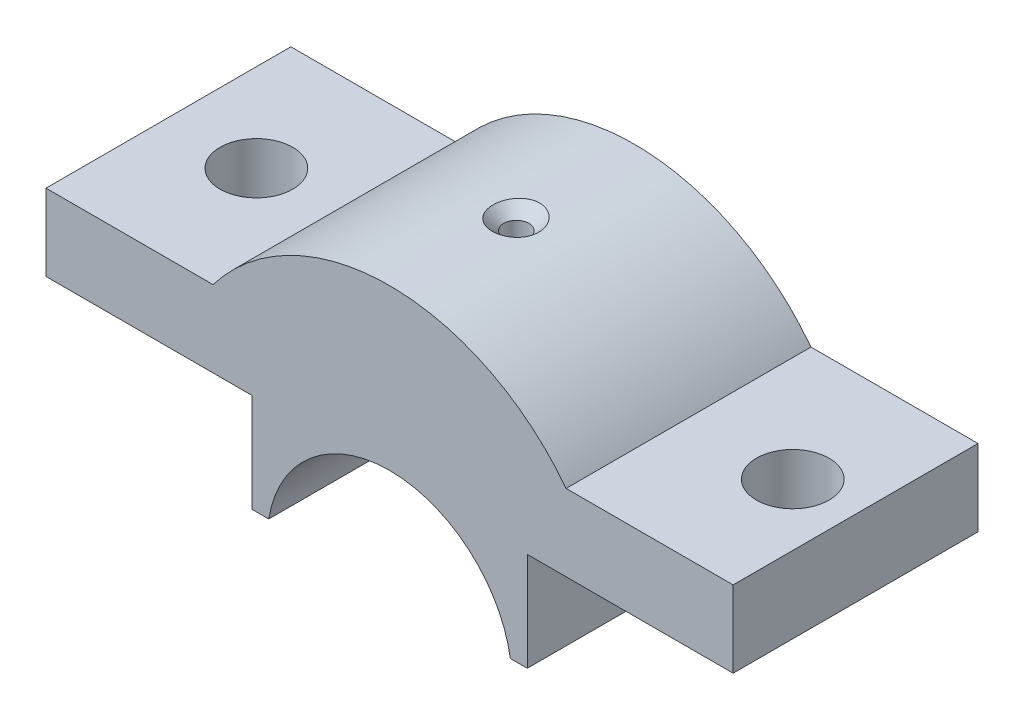
ISO-10303-21;
HEADER;
FILE_DESCRIPTION(('STEP AP214'),'2;1');
FILE_NAME('part.step','',(''),(''),'','','');
FILE_SCHEMA(('AUTOMOTIVE_DESIGN { 1 0 10303 214 1 1 1 1 }'));
ENDSEC;
DATA;
#1=APPLICATION_CONTEXT('core data for automotive mechanical design processes');
#2=APPLICATION_PROTOCOL_DEFINITION('international standard','automotive_design',2000,#1);
#3=PRODUCT_CONTEXT('',#1,'mechanical');
#4=PRODUCT('Part','Part','',(#3));
#5=PRODUCT_RELATED_PRODUCT_CATEGORY('part','',(#4));
#6=PRODUCT_DEFINITION_FORMATION('','',#4);
#7=PRODUCT_DEFINITION_CONTEXT('part definition',#1,'design');
#8=PRODUCT_DEFINITION('design','',#6,#7);
#9=PRODUCT_DEFINITION_SHAPE('','',#8);
#10=(LENGTH_UNIT() NAMED_UNIT(*) SI_UNIT(.MILLI.,.METRE.));
#11=(NAMED_UNIT(*) PLANE_ANGLE_UNIT() SI_UNIT($,.RADIAN.));
#12=(NAMED_UNIT(*) SI_UNIT($,.STERADIAN.) SOLID_ANGLE_UNIT());
#13=UNCERTAINTY_MEASURE_WITH_UNIT(LENGTH_MEASURE(1.E-05),#10,'distance_accuracy_value','');
#14=(GEOMETRIC_REPRESENTATION_CONTEXT(3) GLOBAL_UNCERTAINTY_ASSIGNED_CONTEXT((#13)) GLOBAL_UNIT_ASSIGNED_CONTEXT((#10,
#11,#12)) REPRESENTATION_CONTEXT('',''));
#15=CARTESIAN_POINT('',(0.,0.,0.));
#16=DIRECTION('',(0.,0.,1.));
#17=DIRECTION('',(1.,0.,0.));
#18=AXIS2_PLACEMENT_3D('',#15,#16,#17);
#19=CARTESIAN_POINT('',(53.7975933810534,0.,64.));
#20=DIRECTION('',(0.,1.,0.));
#21=DIRECTION('',(-1.,0.,0.));
#22=AXIS2_PLACEMENT_3D('',#19,#20,#21);
#23=PLANE('',#22);
#24=CARTESIAN_POINT('',(22.9880072725701,0.,32.));
#25=DIRECTION('',(0.,1.,0.));
#26=DIRECTION('',(-1.,0.,0.));
#27=AXIS2_PLACEMENT_3D('',#24,#25,#26);
#28=CIRCLE('',#27,9.49999999999997);
#29=CARTESIAN_POINT('',(13.4880072725701,0.,32.));
#30=VERTEX_POINT('',#29);
#31=EDGE_CURVE('E297',#30,#30,#28,.T.);
#32=ORIENTED_EDGE('',*,*,#31,.T.);
#33=EDGE_LOOP('',(#32));
#34=FACE_BOUND('',#33,.T.);
#35=DIRECTION('',(1.,0.,0.));
#36=VECTOR('',#35,1.);
#37=CARTESIAN_POINT('',(53.7975933810534,0.,0.));
#38=LINE('',#37,#36);
#39=CARTESIAN_POINT('',(0.,0.,0.));
#40=VERTEX_POINT('',#39);
#41=CARTESIAN_POINT('',(53.7975933810534,0.,0.));
#42=VERTEX_POINT('',#41);
#43=EDGE_CURVE('E171',#40,#42,#38,.T.);
#44=ORIENTED_EDGE('',*,*,#43,.T.);
#45=DIRECTION('',(0.,0.,-1.));
#46=VECTOR('',#45,1.);
#47=CARTESIAN_POINT('',(53.7975933810534,0.,64.));
#48=LINE('',#47,#46);
#49=CARTESIAN_POINT('',(53.7975933810534,0.,64.));
#50=VERTEX_POINT('',#49);
#51=EDGE_CURVE('E54',#50,#42,#48,.T.);
#52=ORIENTED_EDGE('',*,*,#51,.F.);
#53=DIRECTION('',(1.,0.,0.));
#54=VECTOR('',#53,1.);
#55=CARTESIAN_POINT('',(53.7975933810534,0.,64.));
#56=LINE('',#55,#54);
#57=CARTESIAN_POINT('',(0.,0.,64.));
#58=VERTEX_POINT('',#57);
#59=EDGE_CURVE('E206',#58,#50,#56,.T.);
#60=ORIENTED_EDGE('',*,*,#59,.F.);
#61=DIRECTION('',(0.,0.,-1.));
#62=VECTOR('',#61,1.);
#63=CARTESIAN_POINT('',(0.,0.,64.));
#64=LINE('',#63,#62);
#65=EDGE_CURVE('E167',#58,#40,#64,.T.);
#66=ORIENTED_EDGE('',*,*,#65,.T.);
#67=EDGE_LOOP('',(#44,#52,#60,#66));
#68=FACE_BOUND('',#67,.T.);
#69=ADVANCED_FACE('F39',(#34,#68),#23,.F.);
#70=CARTESIAN_POINT('',(53.7975933810534,0.,64.));
#71=DIRECTION('',(1.,0.,0.));
#72=DIRECTION('',(0.,0.,-1.));
#73=AXIS2_PLACEMENT_3D('',#70,#71,#72);
#74=PLANE('',#73);
#75=DIRECTION('',(0.,-1.,0.));
#76=VECTOR('',#75,1.);
#77=CARTESIAN_POINT('',(53.7975933810534,0.,0.));
#78=LINE('',#77,#76);
#79=CARTESIAN_POINT('',(53.7975933810534,-25.7783589135465,0.));
#80=VERTEX_POINT('',#79);
#81=EDGE_CURVE('E175',#42,#80,#78,.T.);
#82=ORIENTED_EDGE('',*,*,#81,.T.);
#83=DIRECTION('',(0.,0.,-1.));
#84=VECTOR('',#83,1.);
#85=CARTESIAN_POINT('',(53.7975933810534,-25.7783589135465,64.));
#86=LINE('',#85,#84);
#87=CARTESIAN_POINT('',(53.7975933810534,-25.7783589135465,64.));
#88=VERTEX_POINT('',#87);
#89=EDGE_CURVE('E237',#88,#80,#86,.T.);
#90=ORIENTED_EDGE('',*,*,#89,.F.);
#91=DIRECTION('',(0.,-1.,0.));
#92=VECTOR('',#91,1.);
#93=CARTESIAN_POINT('',(53.7975933810534,0.,64.));
#94=LINE('',#93,#92);
#95=EDGE_CURVE('E118',#50,#88,#94,.T.);
#96=ORIENTED_EDGE('',*,*,#95,.F.);
#97=ORIENTED_EDGE('',*,*,#51,.T.);
#98=EDGE_LOOP('',(#82,#90,#96,#97));
#99=FACE_BOUND('',#98,.T.);
#100=ADVANCED_FACE('F288',(#99),#74,.F.);
#101=CARTESIAN_POINT('',(53.7975933810534,-25.7783589135465,64.));
#102=DIRECTION('',(0.,1.,0.));
#103=DIRECTION('',(0.,0.,1.));
#104=AXIS2_PLACEMENT_3D('',#101,#102,#103);
#105=PLANE('',#104);
#106=DIRECTION('',(1.,0.,0.));
#107=VECTOR('',#106,1.);
#108=CARTESIAN_POINT('',(53.7975933810534,-25.7783589135465,0.));
#109=LINE('',#108,#107);
#110=CARTESIAN_POINT('',(58.2241677918507,-25.7783589135465,0.));
#111=VERTEX_POINT('',#110);
#112=EDGE_CURVE('E179',#80,#111,#109,.T.);
#113=ORIENTED_EDGE('',*,*,#112,.T.);
#114=DIRECTION('',(0.,0.,-1.));
#115=VECTOR('',#114,1.);
#116=CARTESIAN_POINT('',(58.2241677918507,-25.7783589135465,64.));
#117=LINE('',#116,#115);
#118=CARTESIAN_POINT('',(58.2241677918507,-25.7783589135465,64.));
#119=VERTEX_POINT('',#118);
#120=EDGE_CURVE('E233',#119,#111,#117,.T.);
#121=ORIENTED_EDGE('',*,*,#120,.F.);
#122=DIRECTION('',(1.,0.,0.));
#123=VECTOR('',#122,1.);
#124=CARTESIAN_POINT('',(53.7975933810534,-25.7783589135465,64.));
#125=LINE('',#124,#123);
#126=EDGE_CURVE('E306',#88,#119,#125,.T.);
#127=ORIENTED_EDGE('',*,*,#126,.F.);
#128=ORIENTED_EDGE('',*,*,#89,.T.);
#129=EDGE_LOOP('',(#113,#121,#127,#128));
#130=FACE_BOUND('',#129,.T.);
#131=ADVANCED_FACE('F293',(#130),#105,.F.);
#132=CARTESIAN_POINT('',(89.7975933810534,-30.98592999449,64.));
#133=DIRECTION('',(0.,0.,-1.));
#134=DIRECTION('',(-1.,0.,0.));
#135=AXIS2_PLACEMENT_3D('',#132,#133,#134);
#136=CYLINDRICAL_SURFACE('',#135,32.);
#137=CARTESIAN_POINT('',(90.9345285111195,0.993866416838553,35.3));
#138=CARTESIAN_POINT('',(91.1198719424448,0.987274915184741,35.2999919183572));
#139=CARTESIAN_POINT('',(91.3052818610827,0.979054984777652,35.2843325939835));
#140=CARTESIAN_POINT('',(91.6708426633338,0.959719979045138,35.222156603377));
#141=CARTESIAN_POINT('',(91.8509873183535,0.948601617817875,35.1756048217086));
#142=CARTESIAN_POINT('',(92.2006784070634,0.924192008496801,35.0530562931811));
#143=CARTESIAN_POINT('',(92.3702321840717,0.910902289586623,34.9770802172158));
#144=CARTESIAN_POINT('',(92.6941077976478,0.883124863740967,34.7978801122881));
#145=CARTESIAN_POINT('',(92.8484326708329,0.86863739669753,34.6946615305792));
#146=CARTESIAN_POINT('',(93.1382770871462,0.839549995991804,34.4633358140722));
#147=CARTESIAN_POINT('',(93.2737095125601,0.824949849054704,34.3351195203099));
#148=CARTESIAN_POINT('',(93.5211462790916,0.796938014277509,34.0576593818549));
#149=CARTESIAN_POINT('',(93.633149682136,0.783526374036348,33.9084146956078));
#150=CARTESIAN_POINT('',(93.8305485769792,0.759072832079553,33.5930120753752));
#151=CARTESIAN_POINT('',(93.9159359527464,0.748031653508189,33.4268490029127));
#152=CARTESIAN_POINT('',(94.0575399212657,0.729334291333016,33.0823481759855));
#153=CARTESIAN_POINT('',(94.113758032724,0.721677931500725,32.9040110559133));
#154=CARTESIAN_POINT('',(94.1950201775442,0.710510246104323,32.5416697573953));
#155=CARTESIAN_POINT('',(94.2202977750639,0.706967875350072,32.3577189184897));
#156=CARTESIAN_POINT('',(94.2396902801931,0.704255826105265,31.988154061499));
#157=CARTESIAN_POINT('',(94.2338066140178,0.705085947490759,31.8025401199203));
#158=CARTESIAN_POINT('',(94.1911966799871,0.711020904290956,31.4361650396265));
#159=CARTESIAN_POINT('',(94.1546672864773,0.716098452775956,31.2553805066626));
#160=CARTESIAN_POINT('',(94.0521125633226,0.730023744252692,30.9025366067406));
#161=CARTESIAN_POINT('',(93.9860866895516,0.738871556794921,30.7304774008051));
#162=CARTESIAN_POINT('',(93.8262095150821,0.759569479729319,30.3993469320039));
#163=CARTESIAN_POINT('',(93.7322716287644,0.771428915562929,30.2403180783118));
#164=CARTESIAN_POINT('',(93.5193214965986,0.797087562898089,29.9402179411021));
#165=CARTESIAN_POINT('',(93.4003079452628,0.810886875380928,29.7991475931528));
#166=CARTESIAN_POINT('',(93.1394025287606,0.839368716350962,29.537699100133));
#167=CARTESIAN_POINT('',(92.9973241566277,0.854057775070286,29.417507740005));
#168=CARTESIAN_POINT('',(92.6949840031885,0.882991429823605,29.2026455392159));
#169=CARTESIAN_POINT('',(92.5347218139463,0.897236015877152,29.107975271256));
#170=CARTESIAN_POINT('',(92.1999166965676,0.924211134733424,28.9465690615158));
#171=CARTESIAN_POINT('',(92.0253283964082,0.936936517150855,28.8799263141869));
#172=CARTESIAN_POINT('',(91.6672666790515,0.959906667797049,28.7769901321583));
#173=CARTESIAN_POINT('',(91.4837935327972,0.970151511612669,28.7406957726012));
#174=CARTESIAN_POINT('',(91.1140925785437,0.987510611415579,28.699669409058));
#175=CARTESIAN_POINT('',(90.9278820765662,0.994639561644963,28.6947877356846));
#176=CARTESIAN_POINT('',(90.557193249323,1.00559062326734,28.7163915764352));
#177=CARTESIAN_POINT('',(90.3727148689299,1.00941284025743,28.7428760888485));
#178=CARTESIAN_POINT('',(90.0117503158712,1.01386011254473,28.8262617602977));
#179=CARTESIAN_POINT('',(89.8352273057612,1.0145018283239,28.8830026892844));
#180=CARTESIAN_POINT('',(89.4941621593112,1.01308624129422,29.0251922663073));
#181=CARTESIAN_POINT('',(89.3296200830782,1.01102892494562,29.1106410583554));
#182=CARTESIAN_POINT('',(89.0170694659406,1.00493223012184,29.3078781885619));
#183=CARTESIAN_POINT('',(88.8690708794454,1.00089166610178,29.4196822605644));
#184=CARTESIAN_POINT('',(88.5938706593982,0.991719188741047,29.6664448933956));
#185=CARTESIAN_POINT('',(88.4666694860397,0.98658725125686,29.8014039664498));
#186=CARTESIAN_POINT('',(88.2362183272296,0.976164725716718,30.0912007368094));
#187=CARTESIAN_POINT('',(88.1330545545659,0.970873641178483,30.2461069849154));
#188=CARTESIAN_POINT('',(87.954174840101,0.961055264917549,30.5710532005408));
#189=CARTESIAN_POINT('',(87.8784588924895,0.956527973033171,30.7410931648566));
#190=CARTESIAN_POINT('',(87.7565972783396,0.94897395698136,31.0915966603411));
#191=CARTESIAN_POINT('',(87.7104677929953,0.945948054146206,31.2720658366598));
#192=CARTESIAN_POINT('',(87.6491729922771,0.941883079969157,31.6382093109397));
#193=CARTESIAN_POINT('',(87.6340072715569,0.940843982618029,31.8238835407292));
#194=CARTESIAN_POINT('',(87.63507603968,0.940916355970078,32.1947488051328));
#195=CARTESIAN_POINT('',(87.651244510986,0.942023305201858,32.3799400342666));
#196=CARTESIAN_POINT('',(87.7143846054413,0.946204727768647,32.7449712839771));
#197=CARTESIAN_POINT('',(87.7613563411887,0.949279208295757,32.9248112849903));
#198=CARTESIAN_POINT('',(87.8847539182423,0.956907068865392,33.2740369560826));
#199=CARTESIAN_POINT('',(87.9611779648449,0.961460358792643,33.4434232624377));
#200=CARTESIAN_POINT('',(88.1413096877609,0.971304312621282,33.7669782241696));
#201=CARTESIAN_POINT('',(88.2450168812335,0.976594963472517,33.9211471487881));
#202=CARTESIAN_POINT('',(88.4770291882253,0.987020821653373,34.2102301514301));
#203=CARTESIAN_POINT('',(88.6053835901429,0.992155693225302,34.3451046860537));
#204=CARTESIAN_POINT('',(88.8829721948665,1.00129728675013,34.5914383016315));
#205=CARTESIAN_POINT('',(89.0322110346749,1.00530375756577,34.7028921686747));
#206=CARTESIAN_POINT('',(89.3473171492835,1.01128969794808,34.8991778496164));
#207=CARTESIAN_POINT('',(89.5131860538725,1.01326896863036,34.9840070508581));
#208=CARTESIAN_POINT('',(89.8567007559602,1.01447448034585,35.1245237362138));
#209=CARTESIAN_POINT('',(90.0343329940178,1.01370383876662,35.1802441368536));
#210=CARTESIAN_POINT('',(90.3332426216462,1.00980544532345,35.2470157195658));
#211=CARTESIAN_POINT('',(90.4526413848494,1.00759035468926,35.2668619055865));
#212=CARTESIAN_POINT('',(90.6928601846609,1.00176974471696,35.2933566507443));
#213=CARTESIAN_POINT('',(90.8136802148547,0.998164231651811,35.300005269422));
#214=CARTESIAN_POINT('',(90.9345285111195,0.993866416838553,35.3));
#215=B_SPLINE_CURVE_WITH_KNOTS('',3,(#137,#138,#139,#140,#141,#142,#143,#144,#145,#146,#147,
#148,#149,#150,#151,#152,#153,#154,#155,#156,#157,#158,#159,#160,#161,#162,#163,#164,#165,#166,
#167,#168,#169,#170,#171,#172,#173,#174,#175,#176,#177,#178,#179,#180,#181,#182,#183,#184,#185,
#186,#187,#188,#189,#190,#191,#192,#193,#194,#195,#196,#197,#198,#199,#200,#201,#202,#203,#204,
#205,#206,#207,#208,#209,#210,#211,#212,#213,#214),.UNSPECIFIED.,.T.,.F.,(4,2,2,2,2,2,2,2,2,2,2,
2,2,2,2,2,2,2,2,2,2,2,2,2,2,2,2,2,2,2,2,2,2,2,2,2,2,2,4),(0.,0.555938710240734,1.11251044056011,
1.66869188023141,2.2247621932293,2.78331743359385,3.34189503363944,3.90064279464259,
4.45936146136401,5.01383592415988,5.56828500951603,6.11919923727323,6.67012362824853,
7.22277520382786,7.77545555863303,8.33285066080237,8.89025827005092,9.44950493826826,
10.0087345630018,10.5652976879886,11.1218430390521,11.6754699235428,12.2290995853214,
12.7830605993851,13.3370338695277,13.8929644499509,14.4488949126944,15.0051291618551,
15.5613561293142,16.1164124645074,16.6714708286613,17.226495375168,17.7815100998409,
18.3376464998105,18.8939065760551,19.4502212205912,20.0059054096953,20.368392219089,
20.7308773931243),.UNSPECIFIED.);
#216=CARTESIAN_POINT('',(90.9345285111195,0.993866416838553,35.3));
#217=VERTEX_POINT('',#216);
#218=EDGE_CURVE('E42',#217,#217,#215,.T.);
#219=ORIENTED_EDGE('',*,*,#218,.T.);
#220=EDGE_LOOP('',(#219));
#221=FACE_BOUND('',#220,.T.);
#222=CARTESIAN_POINT('',(89.7975933810534,-30.98592999449,0.));
#223=DIRECTION('',(0.,0.,-1.));
#224=DIRECTION('',(1.,0.,0.));
#225=AXIS2_PLACEMENT_3D('',#222,#223,#224);
#226=CIRCLE('',#225,32.);
#227=CARTESIAN_POINT('',(121.371018970256,-25.7783589135464,0.));
#228=VERTEX_POINT('',#227);
#229=EDGE_CURVE('E182',#111,#228,#226,.T.);
#230=ORIENTED_EDGE('',*,*,#229,.T.);
#231=DIRECTION('',(0.,0.,-1.));
#232=VECTOR('',#231,1.);
#233=CARTESIAN_POINT('',(121.371018970256,-25.7783589135464,64.));
#234=LINE('',#233,#232);
#235=CARTESIAN_POINT('',(121.371018970256,-25.7783589135464,64.));
#236=VERTEX_POINT('',#235);
#237=EDGE_CURVE('E229',#236,#228,#234,.T.);
#238=ORIENTED_EDGE('',*,*,#237,.F.);
#239=CARTESIAN_POINT('',(89.7975933810534,-30.98592999449,64.));
#240=DIRECTION('',(0.,0.,-1.));
#241=DIRECTION('',(1.,0.,0.));
#242=AXIS2_PLACEMENT_3D('',#239,#240,#241);
#243=CIRCLE('',#242,32.);
#244=EDGE_CURVE('E309',#119,#236,#243,.T.);
#245=ORIENTED_EDGE('',*,*,#244,.F.);
#246=ORIENTED_EDGE('',*,*,#120,.T.);
#247=EDGE_LOOP('',(#230,#238,#245,#246));
#248=FACE_BOUND('',#247,.T.);
#249=ADVANCED_FACE('F353',(#221,#248),#136,.F.);
#250=CARTESIAN_POINT('',(125.797593381053,-25.7783589135464,64.));
#251=DIRECTION('',(0.,1.,0.));
#252=DIRECTION('',(0.,0.,1.));
#253=AXIS2_PLACEMENT_3D('',#250,#251,#252);
#254=PLANE('',#253);
#255=DIRECTION('',(1.,0.,0.));
#256=VECTOR('',#255,1.);
#257=CARTESIAN_POINT('',(125.797593381053,-25.7783589135464,0.));
#258=LINE('',#257,#256);
#259=CARTESIAN_POINT('',(125.797593381053,-25.7783589135464,0.));
#260=VERTEX_POINT('',#259);
#261=EDGE_CURVE('E185',#228,#260,#258,.T.);
#262=ORIENTED_EDGE('',*,*,#261,.T.);
#263=DIRECTION('',(0.,0.,-1.));
#264=VECTOR('',#263,1.);
#265=CARTESIAN_POINT('',(125.797593381053,-25.7783589135464,64.));
#266=LINE('',#265,#264);
#267=CARTESIAN_POINT('',(125.797593381053,-25.7783589135464,64.));
#268=VERTEX_POINT('',#267);
#269=EDGE_CURVE('E225',#268,#260,#266,.T.);
#270=ORIENTED_EDGE('',*,*,#269,.F.);
#271=DIRECTION('',(1.,0.,0.));
#272=VECTOR('',#271,1.);
#273=CARTESIAN_POINT('',(125.797593381053,-25.7783589135464,64.));
#274=LINE('',#273,#272);
#275=EDGE_CURVE('E313',#236,#268,#274,.T.);
#276=ORIENTED_EDGE('',*,*,#275,.F.);
#277=ORIENTED_EDGE('',*,*,#237,.T.);
#278=EDGE_LOOP('',(#262,#270,#276,#277));
#279=FACE_BOUND('',#278,.T.);
#280=ADVANCED_FACE('F350',(#279),#254,.F.);
#281=CARTESIAN_POINT('',(125.797593381053,0.,64.));
#282=DIRECTION('',(-1.,0.,0.));
#283=DIRECTION('',(0.,-1.,0.));
#284=AXIS2_PLACEMENT_3D('',#281,#282,#283);
#285=PLANE('',#284);
#286=DIRECTION('',(0.,1.,0.));
#287=VECTOR('',#286,1.);
#288=CARTESIAN_POINT('',(125.797593381053,0.,0.));
#289=LINE('',#288,#287);
#290=CARTESIAN_POINT('',(125.797593381053,0.,0.));
#291=VERTEX_POINT('',#290);
#292=EDGE_CURVE('E188',#260,#291,#289,.T.);
#293=ORIENTED_EDGE('',*,*,#292,.T.);
#294=DIRECTION('',(0.,0.,-1.));
#295=VECTOR('',#294,1.);
#296=CARTESIAN_POINT('',(125.797593381053,0.,64.));
#297=LINE('',#296,#295);
#298=CARTESIAN_POINT('',(125.797593381053,0.,64.));
#299=VERTEX_POINT('',#298);
#300=EDGE_CURVE('E221',#299,#291,#297,.T.);
#301=ORIENTED_EDGE('',*,*,#300,.F.);
#302=DIRECTION('',(0.,1.,0.));
#303=VECTOR('',#302,1.);
#304=CARTESIAN_POINT('',(125.797593381053,0.,64.));
#305=LINE('',#304,#303);
#306=EDGE_CURVE('E320',#268,#299,#305,.T.);
#307=ORIENTED_EDGE('',*,*,#306,.F.);
#308=ORIENTED_EDGE('',*,*,#269,.T.);
#309=EDGE_LOOP('',(#293,#301,#307,#308));
#310=FACE_BOUND('',#309,.T.);
#311=ADVANCED_FACE('F346',(#310),#285,.F.);
#312=CARTESIAN_POINT('',(125.797593381053,0.,64.));
#313=DIRECTION('',(0.,1.,0.));
#314=DIRECTION('',(-1.,0.,0.));
#315=AXIS2_PLACEMENT_3D('',#312,#313,#314);
#316=PLANE('',#315);
#317=CARTESIAN_POINT('',(163.454699395392,0.,32.2776021583454));
#318=DIRECTION('',(0.,1.,0.));
#319=DIRECTION('',(-1.,0.,0.));
#320=AXIS2_PLACEMENT_3D('',#317,#318,#319);
#321=CIRCLE('',#320,9.49999999999998);
#322=CARTESIAN_POINT('',(153.954699395392,0.,32.2776021583454));
#323=VERTEX_POINT('',#322);
#324=EDGE_CURVE('E176',#323,#323,#321,.T.);
#325=ORIENTED_EDGE('',*,*,#324,.T.);
#326=EDGE_LOOP('',(#325));
#327=FACE_BOUND('',#326,.T.);
#328=DIRECTION('',(1.,0.,0.));
#329=VECTOR('',#328,1.);
#330=CARTESIAN_POINT('',(125.797593381053,0.,0.));
#331=LINE('',#330,#329);
#332=CARTESIAN_POINT('',(179.595186762107,0.,0.));
#333=VERTEX_POINT('',#332);
#334=EDGE_CURVE('E191',#291,#333,#331,.T.);
#335=ORIENTED_EDGE('',*,*,#334,.T.);
#336=DIRECTION('',(0.,0.,-1.));
#337=VECTOR('',#336,1.);
#338=CARTESIAN_POINT('',(179.595186762107,0.,64.));
#339=LINE('',#338,#337);
#340=CARTESIAN_POINT('',(179.595186762107,0.,64.));
#341=VERTEX_POINT('',#340);
#342=EDGE_CURVE('E217',#341,#333,#339,.T.);
#343=ORIENTED_EDGE('',*,*,#342,.F.);
#344=DIRECTION('',(1.,0.,0.));
#345=VECTOR('',#344,1.);
#346=CARTESIAN_POINT('',(125.797593381053,0.,64.));
#347=LINE('',#346,#345);
#348=EDGE_CURVE('E323',#299,#341,#347,.T.);
#349=ORIENTED_EDGE('',*,*,#348,.F.);
#350=ORIENTED_EDGE('',*,*,#300,.T.);
#351=EDGE_LOOP('',(#335,#343,#349,#350));
#352=FACE_BOUND('',#351,.T.);
#353=ADVANCED_FACE('F342',(#327,#352),#316,.F.);
#354=CARTESIAN_POINT('',(179.595186762107,0.,64.));
#355=DIRECTION('',(-1.,0.,0.));
#356=DIRECTION('',(0.,0.,1.));
#357=AXIS2_PLACEMENT_3D('',#354,#355,#356);
#358=PLANE('',#357);
#359=DIRECTION('',(0.,1.,0.));
#360=VECTOR('',#359,1.);
#361=CARTESIAN_POINT('',(179.595186762107,0.,0.));
#362=LINE('',#361,#360);
#363=CARTESIAN_POINT('',(179.595186762107,20.0000000000001,0.));
#364=VERTEX_POINT('',#363);
#365=EDGE_CURVE('E194',#333,#364,#362,.T.);
#366=ORIENTED_EDGE('',*,*,#365,.T.);
#367=DIRECTION('',(0.,0.,-1.));
#368=VECTOR('',#367,1.);
#369=CARTESIAN_POINT('',(179.595186762107,20.0000000000001,64.));
#370=LINE('',#369,#368);
#371=CARTESIAN_POINT('',(179.595186762107,20.0000000000001,64.));
#372=VERTEX_POINT('',#371);
#373=EDGE_CURVE('E213',#372,#364,#370,.T.);
#374=ORIENTED_EDGE('',*,*,#373,.F.);
#375=DIRECTION('',(0.,1.,0.));
#376=VECTOR('',#375,1.);
#377=CARTESIAN_POINT('',(179.595186762107,0.,64.));
#378=LINE('',#377,#376);
#379=EDGE_CURVE('E326',#341,#372,#378,.T.);
#380=ORIENTED_EDGE('',*,*,#379,.F.);
#381=ORIENTED_EDGE('',*,*,#342,.T.);
#382=EDGE_LOOP('',(#366,#374,#380,#381));
#383=FACE_BOUND('',#382,.T.);
#384=ADVANCED_FACE('F334',(#383),#358,.F.);
#385=CARTESIAN_POINT('',(179.595186762107,20.0000000000001,64.));
#386=DIRECTION('',(0.,-1.,0.));
#387=DIRECTION('',(1.,0.,0.));
#388=AXIS2_PLACEMENT_3D('',#385,#386,#387);
#389=PLANE('',#388);
#390=CARTESIAN_POINT('',(163.454699395392,20.,32.2776021583454));
#391=DIRECTION('',(0.,1.,0.));
#392=DIRECTION('',(0.,0.,1.));
#393=AXIS2_PLACEMENT_3D('',#390,#391,#392);
#394=CIRCLE('',#393,9.49999999999998);
#395=CARTESIAN_POINT('',(163.454699395392,20.,41.7776021583454));
#396=VERTEX_POINT('',#395);
#397=EDGE_CURVE('E245',#396,#396,#394,.T.);
#398=ORIENTED_EDGE('',*,*,#397,.F.);
#399=EDGE_LOOP('',(#398));
#400=FACE_BOUND('',#399,.T.);
#401=DIRECTION('',(-1.,0.,0.));
#402=VECTOR('',#401,1.);
#403=CARTESIAN_POINT('',(179.595186762107,20.0000000000001,0.));
#404=LINE('',#403,#402);
#405=CARTESIAN_POINT('',(135.93452851112,20.,0.));
#406=VERTEX_POINT('',#405);
#407=EDGE_CURVE('E197',#364,#406,#404,.T.);
#408=ORIENTED_EDGE('',*,*,#407,.T.);
#409=DIRECTION('',(0.,0.,-1.));
#410=VECTOR('',#409,1.);
#411=CARTESIAN_POINT('',(135.93452851112,20.,64.));
#412=LINE('',#411,#410);
#413=CARTESIAN_POINT('',(135.93452851112,20.,64.));
#414=VERTEX_POINT('',#413);
#415=EDGE_CURVE('E160',#414,#406,#412,.T.);
#416=ORIENTED_EDGE('',*,*,#415,.F.);
#417=DIRECTION('',(-1.,0.,0.));
#418=VECTOR('',#417,1.);
#419=CARTESIAN_POINT('',(179.595186762107,20.0000000000001,64.));
#420=LINE('',#419,#418);
#421=EDGE_CURVE('E149',#372,#414,#420,.T.);
#422=ORIENTED_EDGE('',*,*,#421,.F.);
#423=ORIENTED_EDGE('',*,*,#373,.T.);
#424=EDGE_LOOP('',(#408,#416,#422,#423));
#425=FACE_BOUND('',#424,.T.);
#426=ADVANCED_FACE('F284',(#400,#425),#389,.F.);
#427=CARTESIAN_POINT('',(89.7975933810534,-15.1480186753688,64.));
#428=DIRECTION('',(0.,0.,-1.));
#429=DIRECTION('',(-1.,0.,0.));
#430=AXIS2_PLACEMENT_3D('',#427,#428,#429);
#431=CYLINDRICAL_SURFACE('',#430,58.);
#432=CARTESIAN_POINT('',(86.5432974233845,42.7606124590206,27.610901027732));
#433=CARTESIAN_POINT('',(86.7522192536243,42.7723523971675,27.3852738535909));
#434=CARTESIAN_POINT('',(86.978096510597,42.7839111326782,27.1752678370064));
#435=CARTESIAN_POINT('',(87.459430580772,42.8053333547462,26.7920542795638));
#436=CARTESIAN_POINT('',(87.7149009581733,42.8151960587297,26.6188637172412));
#437=CARTESIAN_POINT('',(88.2772817278683,42.8328007723749,26.2988933412229));
#438=CARTESIAN_POINT('',(88.5867811006809,42.8402239385066,26.1566081203086));
#439=CARTESIAN_POINT('',(89.2260740610503,42.8500452048997,25.9285969745443));
#440=CARTESIAN_POINT('',(89.5558669222398,42.8524434849098,25.8428690266187));
#441=CARTESIAN_POINT('',(90.2104265799469,42.851393924293,25.7339487043802));
#442=CARTESIAN_POINT('',(90.5347581339952,42.8482028323147,25.708130148048));
#443=CARTESIAN_POINT('',(91.1829229308409,42.8363401653513,25.7122002524223));
#444=CARTESIAN_POINT('',(91.5067562562904,42.827669627119,25.7420783769805));
#445=CARTESIAN_POINT('',(92.1385226797631,42.8055679455101,25.8551880217565));
#446=CARTESIAN_POINT('',(92.4466393331391,42.79222814464,25.9374190224754));
#447=CARTESIAN_POINT('',(93.0450141016943,42.7617741283383,26.1512300101731));
#448=CARTESIAN_POINT('',(93.3352707379031,42.7446596008618,26.2828140776459));
#449=CARTESIAN_POINT('',(93.8966621958983,42.707651408016,26.5941775369008));
#450=CARTESIAN_POINT('',(94.167251283318,42.6877058736591,26.7749329012428));
#451=CARTESIAN_POINT('',(94.6758673299221,42.6470301733677,27.1774662481683));
#452=CARTESIAN_POINT('',(94.9138877396844,42.6262998506826,27.3992524608508));
#453=CARTESIAN_POINT('',(95.3623541936597,42.5848711135839,27.8884599866054));
#454=CARTESIAN_POINT('',(95.5710236749227,42.564218208433,28.1575135022204));
#455=CARTESIAN_POINT('',(95.9426199077903,42.5258371344815,28.7257198047166));
#456=CARTESIAN_POINT('',(96.1055366312484,42.5081096072194,29.0248791707485));
#457=CARTESIAN_POINT('',(96.3885679644787,42.4764583868239,29.6593539123616));
#458=CARTESIAN_POINT('',(96.5064152011202,42.4627428330312,29.9956923247811));
#459=CARTESIAN_POINT('',(96.6859874073184,42.4415484673756,30.683223360626));
#460=CARTESIAN_POINT('',(96.7477036168602,42.4340706290086,31.0344182936677));
#461=CARTESIAN_POINT('',(96.8146068205183,42.4259576900913,31.7519112051343));
#462=CARTESIAN_POINT('',(96.8182090210883,42.4255144306878,32.1183600552763));
#463=CARTESIAN_POINT('',(96.7647197048768,42.4320112328239,32.8467581979604));
#464=CARTESIAN_POINT('',(96.7076233555597,42.4389518822359,33.2087071299187));
#465=CARTESIAN_POINT('',(96.5334343072357,42.4595861907519,33.9201290868735));
#466=CARTESIAN_POINT('',(96.4159655068742,42.4733221622541,34.2695090356535));
#467=CARTESIAN_POINT('',(96.1234753603428,42.5061638463123,34.9430684130198));
#468=CARTESIAN_POINT('',(95.9484547254815,42.5252694925017,35.2672481530054));
#469=CARTESIAN_POINT('',(95.5479026283205,42.5665701239372,35.8758820893095));
#470=CARTESIAN_POINT('',(95.3231328035873,42.588716792675,36.1608400110905));
#471=CARTESIAN_POINT('',(94.8272243101279,42.6340251914111,36.6870343881895));
#472=CARTESIAN_POINT('',(94.5560947038739,42.6571867223659,36.9282793696233));
#473=CARTESIAN_POINT('',(93.9856784732761,42.7012558226729,37.3502086338789));
#474=CARTESIAN_POINT('',(93.6878215804272,42.7222152648483,37.5328181715925));
#475=CARTESIAN_POINT('',(93.0642699806743,42.7607554728947,37.8424099587242));
#476=CARTESIAN_POINT('',(92.7385850971146,42.778337423967,37.9694117416431));
#477=CARTESIAN_POINT('',(92.086286011151,42.8076802890198,38.1576309286592));
#478=CARTESIAN_POINT('',(91.7605452410646,42.8196898386748,38.2218401663064));
#479=CARTESIAN_POINT('',(91.1027298842198,42.8382274586325,38.2926837040671));
#480=CARTESIAN_POINT('',(90.7706568885443,42.8447568878244,38.2993322811375));
#481=CARTESIAN_POINT('',(90.1219967808656,42.8519499532457,38.2555063957905));
#482=CARTESIAN_POINT('',(89.8052748796777,42.8528111908348,38.2070262082162));
#483=CARTESIAN_POINT('',(89.1844082595765,42.8495711260094,38.0579395138225));
#484=CARTESIAN_POINT('',(88.8802633010117,42.8454699181986,37.9573340007375));
#485=CARTESIAN_POINT('',(88.2918015435241,42.8331817016643,37.7071877783765));
#486=CARTESIAN_POINT('',(88.007551962185,42.8249815386819,37.5574900591011));
#487=CARTESIAN_POINT('',(87.4670141033615,42.8057704439975,37.2142756467011));
#488=CARTESIAN_POINT('',(87.2107301976386,42.7947590737268,37.0207521169644));
#489=CARTESIAN_POINT('',(86.7227139146533,42.7709520628888,36.587648999119));
#490=CARTESIAN_POINT('',(86.4923005794026,42.7581041781467,36.3465873793399));
#491=CARTESIAN_POINT('',(86.0728646878626,42.7326400909341,35.8308179021415));
#492=CARTESIAN_POINT('',(85.883851871139,42.7200239436185,35.5561021511626));
#493=CARTESIAN_POINT('',(85.5424714009625,42.695950844444,34.9658022649891));
#494=CARTESIAN_POINT('',(85.3924648970519,42.6845858534405,34.6488482345855));
#495=CARTESIAN_POINT('',(85.1453542361788,42.665233149358,33.9948621090645));
#496=CARTESIAN_POINT('',(85.048259990463,42.6572460690743,33.6578262654343));
#497=CARTESIAN_POINT('',(84.9060515484615,42.645391054588,32.9587919975252));
#498=CARTESIAN_POINT('',(84.863173115927,42.641700761996,32.5963343680497));
#499=CARTESIAN_POINT('',(84.8375415696806,42.6395062840061,31.8692039188936));
#500=CARTESIAN_POINT('',(84.8548052623599,42.6410035482421,31.5045305084491));
#501=CARTESIAN_POINT('',(84.9499412045399,42.6490624152271,30.776875915928));
#502=CARTESIAN_POINT('',(85.0288428852786,42.6557100193925,30.4140298507219));
#503=CARTESIAN_POINT('',(85.2468533386269,42.6732806153226,29.7071436714188));
#504=CARTESIAN_POINT('',(85.3859207944973,42.6842006726384,29.3630908340096));
#505=CARTESIAN_POINT('',(85.6848787432765,42.7061321025545,28.7752731747549));
#506=CARTESIAN_POINT('',(85.8338348249164,42.7166173366275,28.5258674860223));
#507=CARTESIAN_POINT('',(86.164616737311,42.7383263638125,28.0499907566003));
#508=CARTESIAN_POINT('',(86.3464293947836,42.7495498597881,27.8235105808887));
#509=CARTESIAN_POINT('',(86.5432974233845,42.7606124590206,27.610901027732));
#510=B_SPLINE_CURVE_WITH_KNOTS('',3,(#432,#433,#434,#435,#436,#437,#438,#439,#440,#441,#442,
#443,#444,#445,#446,#447,#448,#449,#450,#451,#452,#453,#454,#455,#456,#457,#458,#459,#460,#461,
#462,#463,#464,#465,#466,#467,#468,#469,#470,#471,#472,#473,#474,#475,#476,#477,#478,#479,#480,
#481,#482,#483,#484,#485,#486,#487,#488,#489,#490,#491,#492,#493,#494,#495,#496,#497,#498,#499,
#500,#501,#502,#503,#504,#505,#506,#507,#508,#509),.UNSPECIFIED.,.T.,.F.,(4,2,2,2,2,2,2,2,2,2,2,
2,2,2,2,2,2,2,2,2,2,2,2,2,2,2,2,2,2,2,2,2,2,2,2,2,2,2,4),(0.,0.922339893630548,1.84510423314595,
2.86197292563324,3.87880524236086,4.85014560600339,5.82130223971148,6.77443441581692,
7.72764541392877,8.70136384560875,9.67527780103244,10.6940801689303,11.7131056652309,
12.7781888503927,13.8434382278546,14.9376897588979,16.0320284156737,17.1332686153388,
18.2344952048031,19.3199039937055,20.4051008475099,21.449769298352,22.4940704904306,
23.4857604701825,24.4772044708106,25.4338934576795,26.3905642065854,27.3503249806715,
28.3102355760012,29.3069710833154,30.303940823668,31.3517671423017,32.3997896668608,
33.4897543333132,34.5800236089155,35.6889014840865,36.7970190818907,37.6664921553624,
38.5356173987638),.UNSPECIFIED.);
#511=CARTESIAN_POINT('',(86.5432974233845,42.7606124590206,27.610901027732));
#512=VERTEX_POINT('',#511);
#513=EDGE_CURVE('E11',#512,#512,#510,.T.);
#514=ORIENTED_EDGE('',*,*,#513,.T.);
#515=EDGE_LOOP('',(#514));
#516=FACE_BOUND('',#515,.T.);
#517=CARTESIAN_POINT('',(89.7975933810534,-15.1480186753688,0.));
#518=DIRECTION('',(0.,0.,1.));
#519=DIRECTION('',(-1.,0.,0.));
#520=AXIS2_PLACEMENT_3D('',#517,#518,#519);
#521=CIRCLE('',#520,58.);
#522=CARTESIAN_POINT('',(43.6606582509873,20.,0.));
#523=VERTEX_POINT('',#522);
#524=EDGE_CURVE('E158',#406,#523,#521,.T.);
#525=ORIENTED_EDGE('',*,*,#524,.T.);
#526=DIRECTION('',(0.,0.,-1.));
#527=VECTOR('',#526,1.);
#528=CARTESIAN_POINT('',(43.6606582509873,20.,64.));
#529=LINE('',#528,#527);
#530=CARTESIAN_POINT('',(43.6606582509873,20.,64.));
#531=VERTEX_POINT('',#530);
#532=EDGE_CURVE('E155',#531,#523,#529,.T.);
#533=ORIENTED_EDGE('',*,*,#532,.F.);
#534=CARTESIAN_POINT('',(89.7975933810534,-15.1480186753688,64.));
#535=DIRECTION('',(0.,0.,1.));
#536=DIRECTION('',(-1.,0.,0.));
#537=AXIS2_PLACEMENT_3D('',#534,#535,#536);
#538=CIRCLE('',#537,58.);
#539=EDGE_CURVE('E143',#414,#531,#538,.T.);
#540=ORIENTED_EDGE('',*,*,#539,.F.);
#541=ORIENTED_EDGE('',*,*,#415,.T.);
#542=EDGE_LOOP('',(#525,#533,#540,#541));
#543=FACE_BOUND('',#542,.T.);
#544=ADVANCED_FACE('F156',(#516,#543),#431,.T.);
#545=CARTESIAN_POINT('',(0.,20.,64.));
#546=DIRECTION('',(0.,-1.,0.));
#547=DIRECTION('',(0.,0.,-1.));
#548=AXIS2_PLACEMENT_3D('',#545,#546,#547);
#549=PLANE('',#548);
#550=CARTESIAN_POINT('',(22.9880072725701,20.,32.));
#551=DIRECTION('',(0.,1.,0.));
#552=DIRECTION('',(0.,0.,1.));
#553=AXIS2_PLACEMENT_3D('',#550,#551,#552);
#554=CIRCLE('',#553,9.49999999999998);
#555=CARTESIAN_POINT('',(22.9880072725701,20.,41.5));
#556=VERTEX_POINT('',#555);
#557=EDGE_CURVE('E380',#556,#556,#554,.T.);
#558=ORIENTED_EDGE('',*,*,#557,.F.);
#559=EDGE_LOOP('',(#558));
#560=FACE_BOUND('',#559,.T.);
#561=DIRECTION('',(-1.,0.,0.));
#562=VECTOR('',#561,1.);
#563=CARTESIAN_POINT('',(0.,20.,0.));
#564=LINE('',#563,#562);
#565=CARTESIAN_POINT('',(0.,20.,0.));
#566=VERTEX_POINT('',#565);
#567=EDGE_CURVE('E103',#523,#566,#564,.T.);
#568=ORIENTED_EDGE('',*,*,#567,.T.);
#569=DIRECTION('',(0.,0.,-1.));
#570=VECTOR('',#569,1.);
#571=CARTESIAN_POINT('',(0.,20.,64.));
#572=LINE('',#571,#570);
#573=CARTESIAN_POINT('',(0.,20.,64.));
#574=VERTEX_POINT('',#573);
#575=EDGE_CURVE('E161',#574,#566,#572,.T.);
#576=ORIENTED_EDGE('',*,*,#575,.F.);
#577=DIRECTION('',(-1.,0.,0.));
#578=VECTOR('',#577,1.);
#579=CARTESIAN_POINT('',(0.,20.,64.));
#580=LINE('',#579,#578);
#581=EDGE_CURVE('E147',#531,#574,#580,.T.);
#582=ORIENTED_EDGE('',*,*,#581,.F.);
#583=ORIENTED_EDGE('',*,*,#532,.T.);
#584=EDGE_LOOP('',(#568,#576,#582,#583));
#585=FACE_BOUND('',#584,.T.);
#586=ADVANCED_FACE('F163',(#560,#585),#549,.F.);
#587=CARTESIAN_POINT('',(0.,0.,64.));
#588=DIRECTION('',(1.,0.,0.));
#589=DIRECTION('',(0.,0.,-1.));
#590=AXIS2_PLACEMENT_3D('',#587,#588,#589);
#591=PLANE('',#590);
#592=DIRECTION('',(0.,-1.,0.));
#593=VECTOR('',#592,1.);
#594=CARTESIAN_POINT('',(0.,0.,0.));
#595=LINE('',#594,#593);
#596=EDGE_CURVE('E109',#566,#40,#595,.T.);
#597=ORIENTED_EDGE('',*,*,#596,.T.);
#598=ORIENTED_EDGE('',*,*,#65,.F.);
#599=DIRECTION('',(0.,-1.,0.));
#600=VECTOR('',#599,1.);
#601=CARTESIAN_POINT('',(0.,0.,64.));
#602=LINE('',#601,#600);
#603=EDGE_CURVE('E62',#574,#58,#602,.T.);
#604=ORIENTED_EDGE('',*,*,#603,.F.);
#605=ORIENTED_EDGE('',*,*,#575,.T.);
#606=EDGE_LOOP('',(#597,#598,#604,#605));
#607=FACE_BOUND('',#606,.T.);
#608=ADVANCED_FACE('F274',(#607),#591,.F.);
#609=CARTESIAN_POINT('',(89.7975933810534,-15.1480186753688,64.));
#610=DIRECTION('',(0.,0.,-1.));
#611=DIRECTION('',(-1.,0.,0.));
#612=AXIS2_PLACEMENT_3D('',#609,#610,#611);
#613=PLANE('',#612);
#614=ORIENTED_EDGE('',*,*,#59,.T.);
#615=ORIENTED_EDGE('',*,*,#95,.T.);
#616=ORIENTED_EDGE('',*,*,#126,.T.);
#617=ORIENTED_EDGE('',*,*,#244,.T.);
#618=ORIENTED_EDGE('',*,*,#275,.T.);
#619=ORIENTED_EDGE('',*,*,#306,.T.);
#620=ORIENTED_EDGE('',*,*,#348,.T.);
#621=ORIENTED_EDGE('',*,*,#379,.T.);
#622=ORIENTED_EDGE('',*,*,#421,.T.);
#623=ORIENTED_EDGE('',*,*,#539,.T.);
#624=ORIENTED_EDGE('',*,*,#581,.T.);
#625=ORIENTED_EDGE('',*,*,#603,.T.);
#626=EDGE_LOOP('',(#614,#615,#616,#617,#618,#619,#620,#621,#622,#623,#624,#625));
#627=FACE_BOUND('',#626,.T.);
#628=ADVANCED_FACE('F145',(#627),#613,.F.);
#629=CARTESIAN_POINT('',(89.7975933810534,-15.1480186753688,0.));
#630=DIRECTION('',(0.,0.,-1.));
#631=DIRECTION('',(-1.,0.,0.));
#632=AXIS2_PLACEMENT_3D('',#629,#630,#631);
#633=PLANE('',#632);
#634=ORIENTED_EDGE('',*,*,#43,.F.);
#635=ORIENTED_EDGE('',*,*,#596,.F.);
#636=ORIENTED_EDGE('',*,*,#567,.F.);
#637=ORIENTED_EDGE('',*,*,#524,.F.);
#638=ORIENTED_EDGE('',*,*,#407,.F.);
#639=ORIENTED_EDGE('',*,*,#365,.F.);
#640=ORIENTED_EDGE('',*,*,#334,.F.);
#641=ORIENTED_EDGE('',*,*,#292,.F.);
#642=ORIENTED_EDGE('',*,*,#261,.F.);
#643=ORIENTED_EDGE('',*,*,#229,.F.);
#644=ORIENTED_EDGE('',*,*,#112,.F.);
#645=ORIENTED_EDGE('',*,*,#81,.F.);
#646=EDGE_LOOP('',(#634,#635,#636,#637,#638,#639,#640,#641,#642,#643,#644,#645));
#647=FACE_BOUND('',#646,.T.);
#648=ADVANCED_FACE('F270',(#647),#633,.T.);
#649=CARTESIAN_POINT('',(163.454699395392,20.,32.2776021583454));
#650=DIRECTION('',(0.,1.,0.));
#651=DIRECTION('',(0.,0.,1.));
#652=AXIS2_PLACEMENT_3D('',#649,#650,#651);
#653=CYLINDRICAL_SURFACE('',#652,9.49999999999998);
#654=ORIENTED_EDGE('',*,*,#397,.T.);
#655=EDGE_LOOP('',(#654));
#656=FACE_BOUND('',#655,.T.);
#657=ORIENTED_EDGE('',*,*,#324,.F.);
#658=EDGE_LOOP('',(#657));
#659=FACE_BOUND('',#658,.T.);
#660=ADVANCED_FACE('F266',(#656,#659),#653,.F.);
#661=CARTESIAN_POINT('',(22.9880072725701,20.,32.));
#662=DIRECTION('',(0.,1.,0.));
#663=DIRECTION('',(0.,0.,1.));
#664=AXIS2_PLACEMENT_3D('',#661,#662,#663);
#665=CYLINDRICAL_SURFACE('',#664,9.49999999999997);
#666=ORIENTED_EDGE('',*,*,#557,.T.);
#667=EDGE_LOOP('',(#666));
#668=FACE_BOUND('',#667,.T.);
#669=ORIENTED_EDGE('',*,*,#31,.F.);
#670=EDGE_LOOP('',(#669));
#671=FACE_BOUND('',#670,.T.);
#672=ADVANCED_FACE('F262',(#668,#671),#665,.F.);
#673=CARTESIAN_POINT('',(90.9345285111195,42.8519813246312,32.));
#674=DIRECTION('',(0.,1.,0.));
#675=DIRECTION('',(0.,0.,1.));
#676=AXIS2_PLACEMENT_3D('',#673,#674,#675);
#677=CYLINDRICAL_SURFACE('',#676,3.29999999999998);
#678=CARTESIAN_POINT('',(90.9345285111195,39.8519813246312,32.));
#679=DIRECTION('',(0.,1.,0.));
#680=DIRECTION('',(0.,0.,1.));
#681=AXIS2_PLACEMENT_3D('',#678,#679,#680);
#682=CIRCLE('',#681,3.29999999999998);
#683=CARTESIAN_POINT('',(90.9345285111195,39.8519813246312,35.3));
#684=VERTEX_POINT('',#683);
#685=EDGE_CURVE('E387',#684,#684,#682,.T.);
#686=ORIENTED_EDGE('',*,*,#685,.T.);
#687=EDGE_LOOP('',(#686));
#688=FACE_BOUND('',#687,.T.);
#689=ORIENTED_EDGE('',*,*,#218,.F.);
#690=EDGE_LOOP('',(#689));
#691=FACE_BOUND('',#690,.T.);
#692=ADVANCED_FACE('F257',(#688,#691),#677,.F.);
#693=CARTESIAN_POINT('',(90.9345285111195,42.8519813246312,32.));
#694=DIRECTION('',(0.,1.,0.));
#695=DIRECTION('',(0.,0.,1.));
#696=AXIS2_PLACEMENT_3D('',#693,#694,#695);
#697=CONICAL_SURFACE('',#696,6.3,0.785398163397451);
#698=ORIENTED_EDGE('',*,*,#685,.F.);
#699=EDGE_LOOP('',(#698));
#700=FACE_BOUND('',#699,.T.);
#701=ORIENTED_EDGE('',*,*,#513,.F.);
#702=EDGE_LOOP('',(#701));
#703=FACE_BOUND('',#702,.T.);
#704=ADVANCED_FACE('F254',(#700,#703),#697,.F.);
#705=CLOSED_SHELL('',(#69,#100,#131,#249,#280,#311,#353,#384,#426,#544,#586,#608,#628,#648,#660,
#672,#692,#704));
#706=MANIFOLD_SOLID_BREP('B2',#705);
#707=ADVANCED_BREP_SHAPE_REPRESENTATION('',(#18,#706),#14);
#708=SHAPE_DEFINITION_REPRESENTATION(#9,#707);
ENDSEC;
END-ISO-10303-21;
